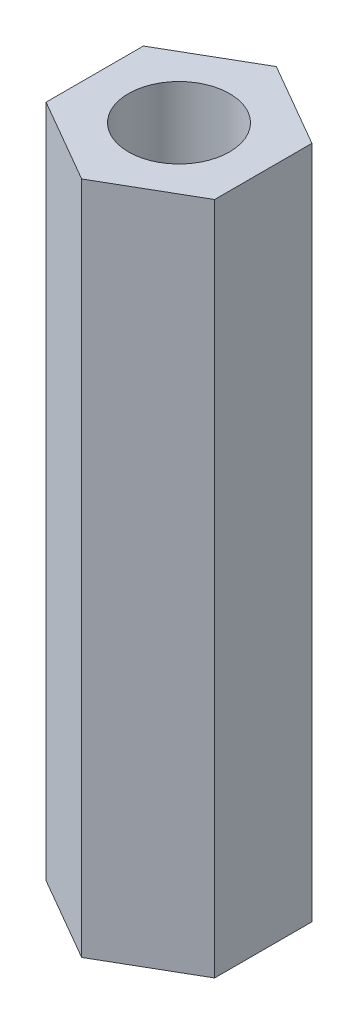
ISO-10303-21;
HEADER;
FILE_DESCRIPTION(('STEP AP214'),'2;1');
FILE_NAME('part.step','',(''),(''),'','','');
FILE_SCHEMA(('AUTOMOTIVE_DESIGN { 1 0 10303 214 1 1 1 1 }'));
ENDSEC;
DATA;
#1=APPLICATION_CONTEXT('core data for automotive mechanical design processes');
#2=APPLICATION_PROTOCOL_DEFINITION('international standard','automotive_design',2000,#1);
#3=PRODUCT_CONTEXT('',#1,'mechanical');
#4=PRODUCT('Part','Part','',(#3));
#5=PRODUCT_RELATED_PRODUCT_CATEGORY('part','',(#4));
#6=PRODUCT_DEFINITION_FORMATION('','',#4);
#7=PRODUCT_DEFINITION_CONTEXT('part definition',#1,'design');
#8=PRODUCT_DEFINITION('design','',#6,#7);
#9=PRODUCT_DEFINITION_SHAPE('','',#8);
#10=(LENGTH_UNIT() NAMED_UNIT(*) SI_UNIT(.MILLI.,.METRE.));
#11=(NAMED_UNIT(*) PLANE_ANGLE_UNIT() SI_UNIT($,.RADIAN.));
#12=(NAMED_UNIT(*) SI_UNIT($,.STERADIAN.) SOLID_ANGLE_UNIT());
#13=UNCERTAINTY_MEASURE_WITH_UNIT(LENGTH_MEASURE(1.E-05),#10,'distance_accuracy_value','');
#14=(GEOMETRIC_REPRESENTATION_CONTEXT(3) GLOBAL_UNCERTAINTY_ASSIGNED_CONTEXT((#13)) GLOBAL_UNIT_ASSIGNED_CONTEXT((#10,
#11,#12)) REPRESENTATION_CONTEXT('',''));
#15=CARTESIAN_POINT('',(0.,0.,0.));
#16=DIRECTION('',(0.,0.,1.));
#17=DIRECTION('',(1.,0.,0.));
#18=AXIS2_PLACEMENT_3D('',#15,#16,#17);
#19=CARTESIAN_POINT('',(2.49999999999998,20.,-1.44337567297407));
#20=DIRECTION('',(-0.5,0.,0.866025403784439));
#21=DIRECTION('',(0.866025403784439,0.,0.5));
#22=AXIS2_PLACEMENT_3D('',#19,#20,#21);
#23=PLANE('',#22);
#24=DIRECTION('',(-0.866025403784439,0.,-0.5));
#25=VECTOR('',#24,1.);
#26=CARTESIAN_POINT('',(2.49999999999998,0.,-1.44337567297407));
#27=LINE('',#26,#25);
#28=CARTESIAN_POINT('',(2.49999999999998,0.,-1.44337567297407));
#29=VERTEX_POINT('',#28);
#30=CARTESIAN_POINT('',(0.,0.,-2.88675134594812));
#31=VERTEX_POINT('',#30);
#32=EDGE_CURVE('E117',#29,#31,#27,.T.);
#33=ORIENTED_EDGE('',*,*,#32,.T.);
#34=DIRECTION('',(0.,-1.,0.));
#35=VECTOR('',#34,1.);
#36=CARTESIAN_POINT('',(0.,20.,-2.88675134594812));
#37=LINE('',#36,#35);
#38=CARTESIAN_POINT('',(0.,20.,-2.88675134594812));
#39=VERTEX_POINT('',#38);
#40=EDGE_CURVE('E11',#39,#31,#37,.T.);
#41=ORIENTED_EDGE('',*,*,#40,.F.);
#42=DIRECTION('',(-0.866025403784439,0.,-0.5));
#43=VECTOR('',#42,1.);
#44=CARTESIAN_POINT('',(2.49999999999998,20.,-1.44337567297407));
#45=LINE('',#44,#43);
#46=CARTESIAN_POINT('',(2.49999999999998,20.,-1.44337567297407));
#47=VERTEX_POINT('',#46);
#48=EDGE_CURVE('E128',#47,#39,#45,.T.);
#49=ORIENTED_EDGE('',*,*,#48,.F.);
#50=DIRECTION('',(0.,-1.,0.));
#51=VECTOR('',#50,1.);
#52=CARTESIAN_POINT('',(2.49999999999998,20.,-1.44337567297407));
#53=LINE('',#52,#51);
#54=EDGE_CURVE('E113',#47,#29,#53,.T.);
#55=ORIENTED_EDGE('',*,*,#54,.T.);
#56=EDGE_LOOP('',(#33,#41,#49,#55));
#57=FACE_BOUND('',#56,.T.);
#58=ADVANCED_FACE('F33',(#57),#23,.F.);
#59=CARTESIAN_POINT('',(0.,20.,-2.88675134594812));
#60=DIRECTION('',(0.499999999999999,0.,0.866025403784439));
#61=DIRECTION('',(0.866025403784439,0.,-0.499999999999999));
#62=AXIS2_PLACEMENT_3D('',#59,#60,#61);
#63=PLANE('',#62);
#64=DIRECTION('',(-0.866025403784439,0.,0.499999999999999));
#65=VECTOR('',#64,1.);
#66=CARTESIAN_POINT('',(0.,0.,-2.88675134594812));
#67=LINE('',#66,#65);
#68=CARTESIAN_POINT('',(-2.5,0.,-1.44337567297407));
#69=VERTEX_POINT('',#68);
#70=EDGE_CURVE('E120',#31,#69,#67,.T.);
#71=ORIENTED_EDGE('',*,*,#70,.T.);
#72=DIRECTION('',(0.,-1.,0.));
#73=VECTOR('',#72,1.);
#74=CARTESIAN_POINT('',(-2.5,20.,-1.44337567297407));
#75=LINE('',#74,#73);
#76=CARTESIAN_POINT('',(-2.5,20.,-1.44337567297407));
#77=VERTEX_POINT('',#76);
#78=EDGE_CURVE('E41',#77,#69,#75,.T.);
#79=ORIENTED_EDGE('',*,*,#78,.F.);
#80=DIRECTION('',(-0.866025403784439,0.,0.499999999999999));
#81=VECTOR('',#80,1.);
#82=CARTESIAN_POINT('',(0.,20.,-2.88675134594812));
#83=LINE('',#82,#81);
#84=EDGE_CURVE('E86',#39,#77,#83,.T.);
#85=ORIENTED_EDGE('',*,*,#84,.F.);
#86=ORIENTED_EDGE('',*,*,#40,.T.);
#87=EDGE_LOOP('',(#71,#79,#85,#86));
#88=FACE_BOUND('',#87,.T.);
#89=ADVANCED_FACE('F153',(#88),#63,.F.);
#90=CARTESIAN_POINT('',(-2.5,20.,-1.44337567297407));
#91=DIRECTION('',(1.,0.,0.));
#92=DIRECTION('',(0.,0.,-1.));
#93=AXIS2_PLACEMENT_3D('',#90,#91,#92);
#94=PLANE('',#93);
#95=DIRECTION('',(0.,0.,1.));
#96=VECTOR('',#95,1.);
#97=CARTESIAN_POINT('',(-2.5,0.,-1.44337567297407));
#98=LINE('',#97,#96);
#99=CARTESIAN_POINT('',(-2.5,0.,1.44337567297407));
#100=VERTEX_POINT('',#99);
#101=EDGE_CURVE('E123',#69,#100,#98,.T.);
#102=ORIENTED_EDGE('',*,*,#101,.T.);
#103=DIRECTION('',(0.,-1.,0.));
#104=VECTOR('',#103,1.);
#105=CARTESIAN_POINT('',(-2.5,20.,1.44337567297407));
#106=LINE('',#105,#104);
#107=CARTESIAN_POINT('',(-2.5,20.,1.44337567297407));
#108=VERTEX_POINT('',#107);
#109=EDGE_CURVE('E108',#108,#100,#106,.T.);
#110=ORIENTED_EDGE('',*,*,#109,.F.);
#111=DIRECTION('',(0.,0.,1.));
#112=VECTOR('',#111,1.);
#113=CARTESIAN_POINT('',(-2.5,20.,-1.44337567297407));
#114=LINE('',#113,#112);
#115=EDGE_CURVE('E99',#77,#108,#114,.T.);
#116=ORIENTED_EDGE('',*,*,#115,.F.);
#117=ORIENTED_EDGE('',*,*,#78,.T.);
#118=EDGE_LOOP('',(#102,#110,#116,#117));
#119=FACE_BOUND('',#118,.T.);
#120=ADVANCED_FACE('F134',(#119),#94,.F.);
#121=CARTESIAN_POINT('',(-2.5,20.,1.44337567297407));
#122=DIRECTION('',(0.499999999999999,0.,-0.866025403784439));
#123=DIRECTION('',(-0.866025403784439,0.,-0.499999999999999));
#124=AXIS2_PLACEMENT_3D('',#121,#122,#123);
#125=PLANE('',#124);
#126=DIRECTION('',(0.866025403784439,0.,0.499999999999999));
#127=VECTOR('',#126,1.);
#128=CARTESIAN_POINT('',(-2.5,0.,1.44337567297407));
#129=LINE('',#128,#127);
#130=CARTESIAN_POINT('',(0.,0.,2.88675134594812));
#131=VERTEX_POINT('',#130);
#132=EDGE_CURVE('E107',#100,#131,#129,.T.);
#133=ORIENTED_EDGE('',*,*,#132,.T.);
#134=DIRECTION('',(0.,-1.,0.));
#135=VECTOR('',#134,1.);
#136=CARTESIAN_POINT('',(0.,20.,2.88675134594812));
#137=LINE('',#136,#135);
#138=CARTESIAN_POINT('',(0.,20.,2.88675134594812));
#139=VERTEX_POINT('',#138);
#140=EDGE_CURVE('E104',#139,#131,#137,.T.);
#141=ORIENTED_EDGE('',*,*,#140,.F.);
#142=DIRECTION('',(0.866025403784439,0.,0.499999999999999));
#143=VECTOR('',#142,1.);
#144=CARTESIAN_POINT('',(-2.5,20.,1.44337567297407));
#145=LINE('',#144,#143);
#146=EDGE_CURVE('E93',#108,#139,#145,.T.);
#147=ORIENTED_EDGE('',*,*,#146,.F.);
#148=ORIENTED_EDGE('',*,*,#109,.T.);
#149=EDGE_LOOP('',(#133,#141,#147,#148));
#150=FACE_BOUND('',#149,.T.);
#151=ADVANCED_FACE('F105',(#150),#125,.F.);
#152=CARTESIAN_POINT('',(0.,20.,2.88675134594812));
#153=DIRECTION('',(-0.500000000000001,0.,-0.866025403784438));
#154=DIRECTION('',(-0.866025403784438,0.,0.500000000000001));
#155=AXIS2_PLACEMENT_3D('',#152,#153,#154);
#156=PLANE('',#155);
#157=DIRECTION('',(0.866025403784438,0.,-0.500000000000001));
#158=VECTOR('',#157,1.);
#159=CARTESIAN_POINT('',(0.,0.,2.88675134594812));
#160=LINE('',#159,#158);
#161=CARTESIAN_POINT('',(2.49999999999999,0.,1.44337567297407));
#162=VERTEX_POINT('',#161);
#163=EDGE_CURVE('E72',#131,#162,#160,.T.);
#164=ORIENTED_EDGE('',*,*,#163,.T.);
#165=DIRECTION('',(0.,-1.,0.));
#166=VECTOR('',#165,1.);
#167=CARTESIAN_POINT('',(2.49999999999999,20.,1.44337567297407));
#168=LINE('',#167,#166);
#169=CARTESIAN_POINT('',(2.49999999999999,20.,1.44337567297407));
#170=VERTEX_POINT('',#169);
#171=EDGE_CURVE('E109',#170,#162,#168,.T.);
#172=ORIENTED_EDGE('',*,*,#171,.F.);
#173=DIRECTION('',(0.866025403784438,0.,-0.500000000000001));
#174=VECTOR('',#173,1.);
#175=CARTESIAN_POINT('',(0.,20.,2.88675134594812));
#176=LINE('',#175,#174);
#177=EDGE_CURVE('E97',#139,#170,#176,.T.);
#178=ORIENTED_EDGE('',*,*,#177,.F.);
#179=ORIENTED_EDGE('',*,*,#140,.T.);
#180=EDGE_LOOP('',(#164,#172,#178,#179));
#181=FACE_BOUND('',#180,.T.);
#182=ADVANCED_FACE('F111',(#181),#156,.F.);
#183=CARTESIAN_POINT('',(2.49999999999999,20.,1.44337567297407));
#184=DIRECTION('',(-1.,0.,0.));
#185=DIRECTION('',(0.,0.,1.));
#186=AXIS2_PLACEMENT_3D('',#183,#184,#185);
#187=PLANE('',#186);
#188=DIRECTION('',(0.,0.,-1.));
#189=VECTOR('',#188,1.);
#190=CARTESIAN_POINT('',(2.49999999999999,0.,1.44337567297407));
#191=LINE('',#190,#189);
#192=EDGE_CURVE('E78',#162,#29,#191,.T.);
#193=ORIENTED_EDGE('',*,*,#192,.T.);
#194=ORIENTED_EDGE('',*,*,#54,.F.);
#195=DIRECTION('',(0.,0.,-1.));
#196=VECTOR('',#195,1.);
#197=CARTESIAN_POINT('',(2.49999999999999,20.,1.44337567297407));
#198=LINE('',#197,#196);
#199=EDGE_CURVE('E49',#170,#47,#198,.T.);
#200=ORIENTED_EDGE('',*,*,#199,.F.);
#201=ORIENTED_EDGE('',*,*,#171,.T.);
#202=EDGE_LOOP('',(#193,#194,#200,#201));
#203=FACE_BOUND('',#202,.T.);
#204=ADVANCED_FACE('F141',(#203),#187,.F.);
#205=CARTESIAN_POINT('',(0.,20.,-2.88675134594812));
#206=DIRECTION('',(0.,1.,0.));
#207=DIRECTION('',(0.,0.,1.));
#208=AXIS2_PLACEMENT_3D('',#205,#206,#207);
#209=PLANE('',#208);
#210=CARTESIAN_POINT('',(0.,20.,0.));
#211=DIRECTION('',(0.,1.,0.));
#212=DIRECTION('',(0.,0.,1.));
#213=AXIS2_PLACEMENT_3D('',#210,#211,#212);
#214=CIRCLE('',#213,1.5);
#215=CARTESIAN_POINT('',(0.,20.,1.5));
#216=VERTEX_POINT('',#215);
#217=EDGE_CURVE('E206',#216,#216,#214,.T.);
#218=ORIENTED_EDGE('',*,*,#217,.F.);
#219=EDGE_LOOP('',(#218));
#220=FACE_BOUND('',#219,.T.);
#221=ORIENTED_EDGE('',*,*,#48,.T.);
#222=ORIENTED_EDGE('',*,*,#84,.T.);
#223=ORIENTED_EDGE('',*,*,#115,.T.);
#224=ORIENTED_EDGE('',*,*,#146,.T.);
#225=ORIENTED_EDGE('',*,*,#177,.T.);
#226=ORIENTED_EDGE('',*,*,#199,.T.);
#227=EDGE_LOOP('',(#221,#222,#223,#224,#225,#226));
#228=FACE_BOUND('',#227,.T.);
#229=ADVANCED_FACE('F95',(#220,#228),#209,.T.);
#230=CARTESIAN_POINT('',(0.,0.,-2.88675134594812));
#231=DIRECTION('',(0.,1.,0.));
#232=DIRECTION('',(0.,0.,1.));
#233=AXIS2_PLACEMENT_3D('',#230,#231,#232);
#234=PLANE('',#233);
#235=CARTESIAN_POINT('',(0.,0.,0.));
#236=DIRECTION('',(0.,1.,0.));
#237=DIRECTION('',(0.,0.,1.));
#238=AXIS2_PLACEMENT_3D('',#235,#236,#237);
#239=CIRCLE('',#238,1.5);
#240=CARTESIAN_POINT('',(0.,0.,1.5));
#241=VERTEX_POINT('',#240);
#242=EDGE_CURVE('E121',#241,#241,#239,.F.);
#243=ORIENTED_EDGE('',*,*,#242,.F.);
#244=EDGE_LOOP('',(#243));
#245=FACE_BOUND('',#244,.T.);
#246=ORIENTED_EDGE('',*,*,#32,.F.);
#247=ORIENTED_EDGE('',*,*,#192,.F.);
#248=ORIENTED_EDGE('',*,*,#163,.F.);
#249=ORIENTED_EDGE('',*,*,#132,.F.);
#250=ORIENTED_EDGE('',*,*,#101,.F.);
#251=ORIENTED_EDGE('',*,*,#70,.F.);
#252=EDGE_LOOP('',(#246,#247,#248,#249,#250,#251));
#253=FACE_BOUND('',#252,.T.);
#254=ADVANCED_FACE('F137',(#245,#253),#234,.F.);
#255=CARTESIAN_POINT('',(0.,-0.001000000000001,0.));
#256=DIRECTION('',(0.,1.,0.));
#257=DIRECTION('',(0.,0.,1.));
#258=AXIS2_PLACEMENT_3D('',#255,#256,#257);
#259=CYLINDRICAL_SURFACE('',#258,1.5);
#260=ORIENTED_EDGE('',*,*,#217,.T.);
#261=EDGE_LOOP('',(#260));
#262=FACE_BOUND('',#261,.T.);
#263=ORIENTED_EDGE('',*,*,#242,.T.);
#264=EDGE_LOOP('',(#263));
#265=FACE_BOUND('',#264,.T.);
#266=ADVANCED_FACE('F190',(#262,#265),#259,.F.);
#267=CLOSED_SHELL('',(#58,#89,#120,#151,#182,#204,#229,#254,#266));
#268=MANIFOLD_SOLID_BREP('B2',#267);
#269=ADVANCED_BREP_SHAPE_REPRESENTATION('',(#18,#268),#14);
#270=SHAPE_DEFINITION_REPRESENTATION(#9,#269);
ENDSEC;
END-ISO-10303-21;
